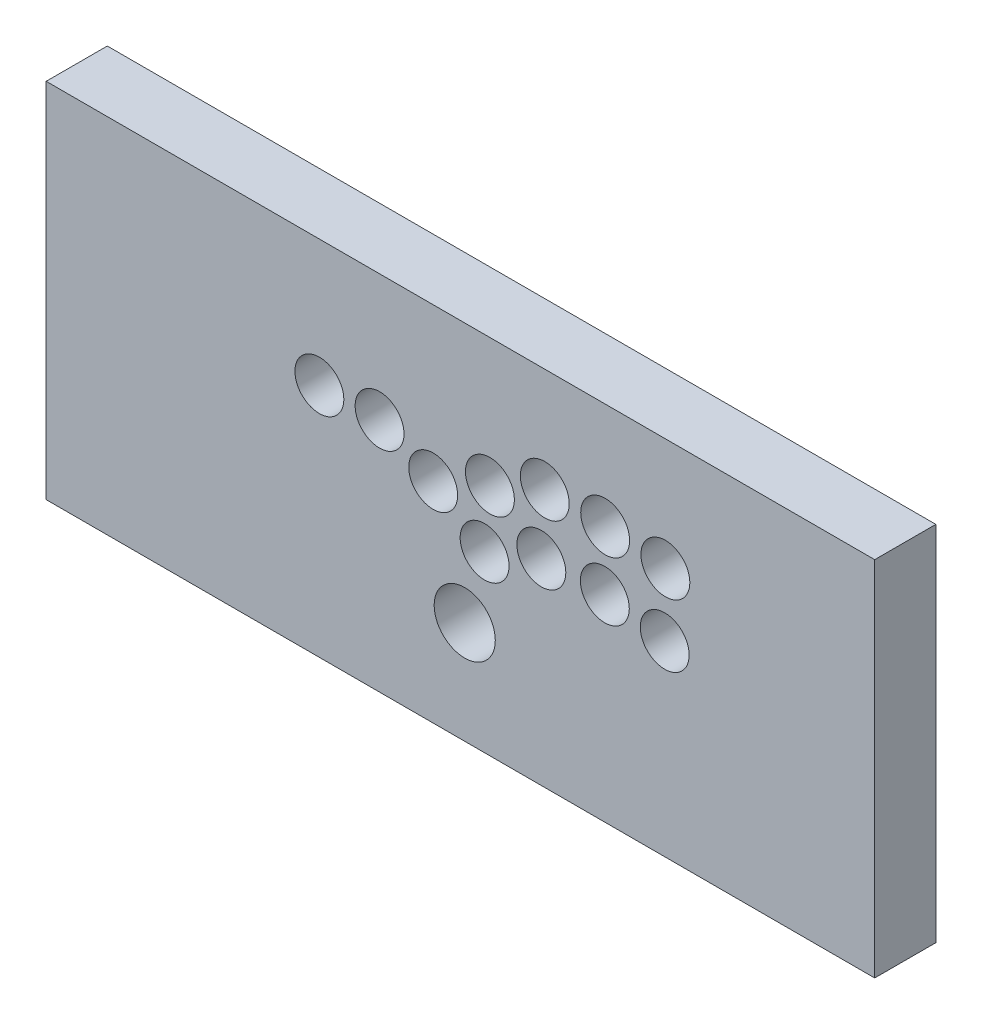
ISO-10303-21;
HEADER;
FILE_DESCRIPTION(('STEP AP214'),'2;1');
FILE_NAME('part.step','',(''),(''),'','','');
FILE_SCHEMA(('AUTOMOTIVE_DESIGN { 1 0 10303 214 1 1 1 1 }'));
ENDSEC;
DATA;
#1=APPLICATION_CONTEXT('core data for automotive mechanical design processes');
#2=APPLICATION_PROTOCOL_DEFINITION('international standard','automotive_design',2000,#1);
#3=PRODUCT_CONTEXT('',#1,'mechanical');
#4=PRODUCT('Part','Part','',(#3));
#5=PRODUCT_RELATED_PRODUCT_CATEGORY('part','',(#4));
#6=PRODUCT_DEFINITION_FORMATION('','',#4);
#7=PRODUCT_DEFINITION_CONTEXT('part definition',#1,'design');
#8=PRODUCT_DEFINITION('design','',#6,#7);
#9=PRODUCT_DEFINITION_SHAPE('','',#8);
#10=(LENGTH_UNIT() NAMED_UNIT(*) SI_UNIT(.MILLI.,.METRE.));
#11=(NAMED_UNIT(*) PLANE_ANGLE_UNIT() SI_UNIT($,.RADIAN.));
#12=(NAMED_UNIT(*) SI_UNIT($,.STERADIAN.) SOLID_ANGLE_UNIT());
#13=UNCERTAINTY_MEASURE_WITH_UNIT(LENGTH_MEASURE(1.E-05),#10,'distance_accuracy_value','');
#14=(GEOMETRIC_REPRESENTATION_CONTEXT(3) GLOBAL_UNCERTAINTY_ASSIGNED_CONTEXT((#13)) GLOBAL_UNIT_ASSIGNED_CONTEXT((#10,
#11,#12)) REPRESENTATION_CONTEXT('',''));
#15=CARTESIAN_POINT('',(0.,0.,0.));
#16=DIRECTION('',(0.,0.,1.));
#17=DIRECTION('',(1.,0.,0.));
#18=AXIS2_PLACEMENT_3D('',#15,#16,#17);
#19=CARTESIAN_POINT('',(134.079250809789,115.620543460692,30.));
#20=DIRECTION('',(0.,0.,-1.));
#21=DIRECTION('',(-1.,0.,0.));
#22=AXIS2_PLACEMENT_3D('',#19,#20,#21);
#23=CYLINDRICAL_SURFACE('',#22,12.);
#24=CARTESIAN_POINT('',(134.079250809789,115.620543460692,30.));
#25=DIRECTION('',(0.,0.,1.));
#26=DIRECTION('',(1.,0.,0.));
#27=AXIS2_PLACEMENT_3D('',#24,#25,#26);
#28=CIRCLE('',#27,12.);
#29=CARTESIAN_POINT('',(146.079250809789,115.620543460692,30.));
#30=VERTEX_POINT('',#29);
#31=EDGE_CURVE('E119',#30,#30,#28,.T.);
#32=ORIENTED_EDGE('',*,*,#31,.T.);
#33=EDGE_LOOP('',(#32));
#34=FACE_BOUND('',#33,.T.);
#35=CARTESIAN_POINT('',(134.079250809789,115.620543460692,4.));
#36=DIRECTION('',(0.,0.,-1.));
#37=DIRECTION('',(-1.,0.,0.));
#38=AXIS2_PLACEMENT_3D('',#35,#36,#37);
#39=CIRCLE('',#38,12.);
#40=CARTESIAN_POINT('',(122.079250809789,115.620543460692,4.));
#41=VERTEX_POINT('',#40);
#42=EDGE_CURVE('E182',#41,#41,#39,.T.);
#43=ORIENTED_EDGE('',*,*,#42,.T.);
#44=EDGE_LOOP('',(#43));
#45=FACE_BOUND('',#44,.T.);
#46=ADVANCED_FACE('F45',(#34,#45),#23,.F.);
#47=CARTESIAN_POINT('',(163.619308257506,115.709309954712,30.));
#48=DIRECTION('',(0.,0.,-1.));
#49=DIRECTION('',(-1.,0.,0.));
#50=AXIS2_PLACEMENT_3D('',#47,#48,#49);
#51=CYLINDRICAL_SURFACE('',#50,12.);
#52=CARTESIAN_POINT('',(163.619308257506,115.709309954712,30.));
#53=DIRECTION('',(0.,0.,1.));
#54=DIRECTION('',(1.,0.,0.));
#55=AXIS2_PLACEMENT_3D('',#52,#53,#54);
#56=CIRCLE('',#55,12.);
#57=CARTESIAN_POINT('',(175.619308257506,115.709309954712,30.));
#58=VERTEX_POINT('',#57);
#59=EDGE_CURVE('E138',#58,#58,#56,.T.);
#60=ORIENTED_EDGE('',*,*,#59,.T.);
#61=EDGE_LOOP('',(#60));
#62=FACE_BOUND('',#61,.T.);
#63=CARTESIAN_POINT('',(163.619308257506,115.709309954712,4.));
#64=DIRECTION('',(0.,0.,-1.));
#65=DIRECTION('',(-1.,0.,0.));
#66=AXIS2_PLACEMENT_3D('',#63,#64,#65);
#67=CIRCLE('',#66,12.);
#68=CARTESIAN_POINT('',(151.619308257506,115.709309954712,4.));
#69=VERTEX_POINT('',#68);
#70=EDGE_CURVE('E186',#69,#69,#67,.T.);
#71=ORIENTED_EDGE('',*,*,#70,.T.);
#72=EDGE_LOOP('',(#71));
#73=FACE_BOUND('',#72,.T.);
#74=ADVANCED_FACE('F251',(#62,#73),#51,.F.);
#75=CARTESIAN_POINT('',(189.931391461446,102.812951429492,30.));
#76=DIRECTION('',(0.,0.,-1.));
#77=DIRECTION('',(-1.,0.,0.));
#78=AXIS2_PLACEMENT_3D('',#75,#76,#77);
#79=CYLINDRICAL_SURFACE('',#78,12.);
#80=CARTESIAN_POINT('',(189.931391461446,102.812951429492,30.));
#81=DIRECTION('',(0.,0.,1.));
#82=DIRECTION('',(1.,0.,0.));
#83=AXIS2_PLACEMENT_3D('',#80,#81,#82);
#84=CIRCLE('',#83,12.);
#85=CARTESIAN_POINT('',(201.931391461446,102.812951429492,30.));
#86=VERTEX_POINT('',#85);
#87=EDGE_CURVE('E142',#86,#86,#84,.T.);
#88=ORIENTED_EDGE('',*,*,#87,.T.);
#89=EDGE_LOOP('',(#88));
#90=FACE_BOUND('',#89,.T.);
#91=CARTESIAN_POINT('',(189.931391461446,102.812951429492,4.));
#92=DIRECTION('',(0.,0.,-1.));
#93=DIRECTION('',(-1.,0.,0.));
#94=AXIS2_PLACEMENT_3D('',#91,#92,#93);
#95=CIRCLE('',#94,12.);
#96=CARTESIAN_POINT('',(177.931391461446,102.812951429492,4.));
#97=VERTEX_POINT('',#96);
#98=EDGE_CURVE('E190',#97,#97,#95,.T.);
#99=ORIENTED_EDGE('',*,*,#98,.T.);
#100=EDGE_LOOP('',(#99));
#101=FACE_BOUND('',#100,.T.);
#102=ADVANCED_FACE('F258',(#90,#101),#79,.F.);
#103=CARTESIAN_POINT('',(215.148770887191,85.4310451612831,30.));
#104=DIRECTION('',(0.,0.,-1.));
#105=DIRECTION('',(-1.,0.,0.));
#106=AXIS2_PLACEMENT_3D('',#103,#104,#105);
#107=CYLINDRICAL_SURFACE('',#106,12.);
#108=CARTESIAN_POINT('',(215.148770887191,85.4310451612831,30.));
#109=DIRECTION('',(0.,0.,1.));
#110=DIRECTION('',(1.,0.,0.));
#111=AXIS2_PLACEMENT_3D('',#108,#109,#110);
#112=CIRCLE('',#111,12.);
#113=CARTESIAN_POINT('',(227.148770887191,85.4310451612831,30.));
#114=VERTEX_POINT('',#113);
#115=EDGE_CURVE('E146',#114,#114,#112,.T.);
#116=ORIENTED_EDGE('',*,*,#115,.T.);
#117=EDGE_LOOP('',(#116));
#118=FACE_BOUND('',#117,.T.);
#119=CARTESIAN_POINT('',(215.148770887191,85.4310451612831,4.));
#120=DIRECTION('',(0.,0.,-1.));
#121=DIRECTION('',(-1.,0.,0.));
#122=AXIS2_PLACEMENT_3D('',#119,#120,#121);
#123=CIRCLE('',#122,12.);
#124=CARTESIAN_POINT('',(203.148770887191,85.4310451612831,4.));
#125=VERTEX_POINT('',#124);
#126=EDGE_CURVE('E194',#125,#125,#123,.T.);
#127=ORIENTED_EDGE('',*,*,#126,.T.);
#128=EDGE_LOOP('',(#127));
#129=FACE_BOUND('',#128,.T.);
#130=ADVANCED_FACE('F346',(#118,#129),#107,.F.);
#131=CARTESIAN_POINT('',(205.406615554664,50.3603644328971,30.));
#132=DIRECTION('',(0.,0.,-1.));
#133=DIRECTION('',(-1.,0.,0.));
#134=AXIS2_PLACEMENT_3D('',#131,#132,#133);
#135=CYLINDRICAL_SURFACE('',#134,15.);
#136=CARTESIAN_POINT('',(205.406615554664,50.3603644328971,30.));
#137=DIRECTION('',(0.,0.,1.));
#138=DIRECTION('',(1.,0.,0.));
#139=AXIS2_PLACEMENT_3D('',#136,#137,#138);
#140=CIRCLE('',#139,15.);
#141=CARTESIAN_POINT('',(220.406615554664,50.3603644328971,30.));
#142=VERTEX_POINT('',#141);
#143=EDGE_CURVE('E150',#142,#142,#140,.T.);
#144=ORIENTED_EDGE('',*,*,#143,.T.);
#145=EDGE_LOOP('',(#144));
#146=FACE_BOUND('',#145,.T.);
#147=CARTESIAN_POINT('',(205.406615554664,50.3603644328971,4.));
#148=DIRECTION('',(0.,0.,-1.));
#149=DIRECTION('',(-1.,0.,0.));
#150=AXIS2_PLACEMENT_3D('',#147,#148,#149);
#151=CIRCLE('',#150,15.);
#152=CARTESIAN_POINT('',(190.406615554664,50.3603644328971,4.));
#153=VERTEX_POINT('',#152);
#154=EDGE_CURVE('E198',#153,#153,#151,.T.);
#155=ORIENTED_EDGE('',*,*,#154,.T.);
#156=EDGE_LOOP('',(#155));
#157=FACE_BOUND('',#156,.T.);
#158=ADVANCED_FACE('F338',(#146,#157),#135,.F.);
#159=CARTESIAN_POINT('',(217.770290506371,114.829364890886,30.));
#160=DIRECTION('',(0.,0.,-1.));
#161=DIRECTION('',(-1.,0.,0.));
#162=AXIS2_PLACEMENT_3D('',#159,#160,#161);
#163=CYLINDRICAL_SURFACE('',#162,12.);
#164=CARTESIAN_POINT('',(217.770290506371,114.829364890886,30.));
#165=DIRECTION('',(0.,0.,1.));
#166=DIRECTION('',(1.,0.,0.));
#167=AXIS2_PLACEMENT_3D('',#164,#165,#166);
#168=CIRCLE('',#167,12.);
#169=CARTESIAN_POINT('',(229.770290506371,114.829364890886,30.));
#170=VERTEX_POINT('',#169);
#171=EDGE_CURVE('E154',#170,#170,#168,.T.);
#172=ORIENTED_EDGE('',*,*,#171,.T.);
#173=EDGE_LOOP('',(#172));
#174=FACE_BOUND('',#173,.T.);
#175=CARTESIAN_POINT('',(217.770290506371,114.829364890886,4.));
#176=DIRECTION('',(0.,0.,-1.));
#177=DIRECTION('',(-1.,0.,0.));
#178=AXIS2_PLACEMENT_3D('',#175,#176,#177);
#179=CIRCLE('',#178,12.);
#180=CARTESIAN_POINT('',(205.770290506371,114.829364890886,4.));
#181=VERTEX_POINT('',#180);
#182=EDGE_CURVE('E202',#181,#181,#179,.T.);
#183=ORIENTED_EDGE('',*,*,#182,.T.);
#184=EDGE_LOOP('',(#183));
#185=FACE_BOUND('',#184,.T.);
#186=ADVANCED_FACE('F330',(#174,#185),#163,.F.);
#187=CARTESIAN_POINT('',(244.688210228627,126.55124727172,30.));
#188=DIRECTION('',(0.,0.,-1.));
#189=DIRECTION('',(-1.,0.,0.));
#190=AXIS2_PLACEMENT_3D('',#187,#188,#189);
#191=CYLINDRICAL_SURFACE('',#190,12.);
#192=CARTESIAN_POINT('',(244.688210228627,126.55124727172,30.));
#193=DIRECTION('',(0.,0.,1.));
#194=DIRECTION('',(1.,0.,0.));
#195=AXIS2_PLACEMENT_3D('',#192,#193,#194);
#196=CIRCLE('',#195,12.);
#197=CARTESIAN_POINT('',(256.688210228627,126.55124727172,30.));
#198=VERTEX_POINT('',#197);
#199=EDGE_CURVE('E158',#198,#198,#196,.T.);
#200=ORIENTED_EDGE('',*,*,#199,.T.);
#201=EDGE_LOOP('',(#200));
#202=FACE_BOUND('',#201,.T.);
#203=CARTESIAN_POINT('',(244.688210228627,126.55124727172,4.));
#204=DIRECTION('',(0.,0.,-1.));
#205=DIRECTION('',(-1.,0.,0.));
#206=AXIS2_PLACEMENT_3D('',#203,#204,#205);
#207=CIRCLE('',#206,12.);
#208=CARTESIAN_POINT('',(232.688210228627,126.55124727172,4.));
#209=VERTEX_POINT('',#208);
#210=EDGE_CURVE('E206',#209,#209,#207,.T.);
#211=ORIENTED_EDGE('',*,*,#210,.T.);
#212=EDGE_LOOP('',(#211));
#213=FACE_BOUND('',#212,.T.);
#214=ADVANCED_FACE('F322',(#202,#213),#191,.F.);
#215=CARTESIAN_POINT('',(274.330365620166,125.743518947919,30.));
#216=DIRECTION('',(0.,0.,-1.));
#217=DIRECTION('',(-1.,0.,0.));
#218=AXIS2_PLACEMENT_3D('',#215,#216,#217);
#219=CYLINDRICAL_SURFACE('',#218,12.);
#220=CARTESIAN_POINT('',(274.330365620166,125.743518947919,30.));
#221=DIRECTION('',(0.,0.,1.));
#222=DIRECTION('',(1.,0.,0.));
#223=AXIS2_PLACEMENT_3D('',#220,#221,#222);
#224=CIRCLE('',#223,12.);
#225=CARTESIAN_POINT('',(286.330365620166,125.743518947919,30.));
#226=VERTEX_POINT('',#225);
#227=EDGE_CURVE('E162',#226,#226,#224,.T.);
#228=ORIENTED_EDGE('',*,*,#227,.T.);
#229=EDGE_LOOP('',(#228));
#230=FACE_BOUND('',#229,.T.);
#231=CARTESIAN_POINT('',(274.330365620166,125.743518947919,4.));
#232=DIRECTION('',(0.,0.,-1.));
#233=DIRECTION('',(-1.,0.,0.));
#234=AXIS2_PLACEMENT_3D('',#231,#232,#233);
#235=CIRCLE('',#234,12.);
#236=CARTESIAN_POINT('',(262.330365620166,125.743518947919,4.));
#237=VERTEX_POINT('',#236);
#238=EDGE_CURVE('E210',#237,#237,#235,.T.);
#239=ORIENTED_EDGE('',*,*,#238,.T.);
#240=EDGE_LOOP('',(#239));
#241=FACE_BOUND('',#240,.T.);
#242=ADVANCED_FACE('F314',(#230,#241),#219,.F.);
#243=CARTESIAN_POINT('',(303.876863168261,122.656060434376,30.));
#244=DIRECTION('',(0.,0.,-1.));
#245=DIRECTION('',(-1.,0.,0.));
#246=AXIS2_PLACEMENT_3D('',#243,#244,#245);
#247=CYLINDRICAL_SURFACE('',#246,12.);
#248=CARTESIAN_POINT('',(303.876863168261,122.656060434376,30.));
#249=DIRECTION('',(0.,0.,1.));
#250=DIRECTION('',(1.,0.,0.));
#251=AXIS2_PLACEMENT_3D('',#248,#249,#250);
#252=CIRCLE('',#251,12.);
#253=CARTESIAN_POINT('',(315.876863168261,122.656060434376,30.));
#254=VERTEX_POINT('',#253);
#255=EDGE_CURVE('E166',#254,#254,#252,.T.);
#256=ORIENTED_EDGE('',*,*,#255,.T.);
#257=EDGE_LOOP('',(#256));
#258=FACE_BOUND('',#257,.T.);
#259=CARTESIAN_POINT('',(303.876863168261,122.656060434376,4.));
#260=DIRECTION('',(0.,0.,-1.));
#261=DIRECTION('',(-1.,0.,0.));
#262=AXIS2_PLACEMENT_3D('',#259,#260,#261);
#263=CIRCLE('',#262,12.);
#264=CARTESIAN_POINT('',(291.876863168261,122.656060434376,4.));
#265=VERTEX_POINT('',#264);
#266=EDGE_CURVE('E214',#265,#265,#263,.T.);
#267=ORIENTED_EDGE('',*,*,#266,.T.);
#268=EDGE_LOOP('',(#267));
#269=FACE_BOUND('',#268,.T.);
#270=ADVANCED_FACE('F306',(#258,#269),#247,.F.);
#271=CARTESIAN_POINT('',(303.547623980309,91.7016931934191,30.));
#272=DIRECTION('',(0.,0.,-1.));
#273=DIRECTION('',(-1.,0.,0.));
#274=AXIS2_PLACEMENT_3D('',#271,#272,#273);
#275=CYLINDRICAL_SURFACE('',#274,12.);
#276=CARTESIAN_POINT('',(303.547623980309,91.7016931934191,30.));
#277=DIRECTION('',(0.,0.,1.));
#278=DIRECTION('',(1.,0.,0.));
#279=AXIS2_PLACEMENT_3D('',#276,#277,#278);
#280=CIRCLE('',#279,12.);
#281=CARTESIAN_POINT('',(315.547623980309,91.7016931934191,30.));
#282=VERTEX_POINT('',#281);
#283=EDGE_CURVE('E170',#282,#282,#280,.T.);
#284=ORIENTED_EDGE('',*,*,#283,.T.);
#285=EDGE_LOOP('',(#284));
#286=FACE_BOUND('',#285,.T.);
#287=CARTESIAN_POINT('',(303.547623980309,91.7016931934191,4.));
#288=DIRECTION('',(0.,0.,-1.));
#289=DIRECTION('',(-1.,0.,0.));
#290=AXIS2_PLACEMENT_3D('',#287,#288,#289);
#291=CIRCLE('',#290,12.);
#292=CARTESIAN_POINT('',(291.54762398031,91.7016931934191,4.));
#293=VERTEX_POINT('',#292);
#294=EDGE_CURVE('E218',#293,#293,#291,.T.);
#295=ORIENTED_EDGE('',*,*,#294,.T.);
#296=EDGE_LOOP('',(#295));
#297=FACE_BOUND('',#296,.T.);
#298=ADVANCED_FACE('F298',(#286,#297),#275,.F.);
#299=CARTESIAN_POINT('',(274.160623302342,96.7225198912755,30.));
#300=DIRECTION('',(0.,0.,-1.));
#301=DIRECTION('',(-1.,0.,0.));
#302=AXIS2_PLACEMENT_3D('',#299,#300,#301);
#303=CYLINDRICAL_SURFACE('',#302,12.);
#304=CARTESIAN_POINT('',(274.160623302342,96.7225198912755,30.));
#305=DIRECTION('',(0.,0.,1.));
#306=DIRECTION('',(1.,0.,0.));
#307=AXIS2_PLACEMENT_3D('',#304,#305,#306);
#308=CIRCLE('',#307,12.);
#309=CARTESIAN_POINT('',(286.160623302342,96.7225198912755,30.));
#310=VERTEX_POINT('',#309);
#311=EDGE_CURVE('E174',#310,#310,#308,.T.);
#312=ORIENTED_EDGE('',*,*,#311,.T.);
#313=EDGE_LOOP('',(#312));
#314=FACE_BOUND('',#313,.T.);
#315=CARTESIAN_POINT('',(274.160623302342,96.7225198912755,4.));
#316=DIRECTION('',(0.,0.,-1.));
#317=DIRECTION('',(-1.,0.,0.));
#318=AXIS2_PLACEMENT_3D('',#315,#316,#317);
#319=CIRCLE('',#318,12.);
#320=CARTESIAN_POINT('',(262.160623302342,96.7225198912755,4.));
#321=VERTEX_POINT('',#320);
#322=EDGE_CURVE('E222',#321,#321,#319,.T.);
#323=ORIENTED_EDGE('',*,*,#322,.T.);
#324=EDGE_LOOP('',(#323));
#325=FACE_BOUND('',#324,.T.);
#326=ADVANCED_FACE('F290',(#314,#325),#303,.F.);
#327=CARTESIAN_POINT('',(243.010025323637,96.4473438033064,30.));
#328=DIRECTION('',(0.,0.,-1.));
#329=DIRECTION('',(-1.,0.,0.));
#330=AXIS2_PLACEMENT_3D('',#327,#328,#329);
#331=CYLINDRICAL_SURFACE('',#330,12.);
#332=CARTESIAN_POINT('',(243.010025323637,96.4473438033064,30.));
#333=DIRECTION('',(0.,0.,1.));
#334=DIRECTION('',(1.,0.,0.));
#335=AXIS2_PLACEMENT_3D('',#332,#333,#334);
#336=CIRCLE('',#335,12.);
#337=CARTESIAN_POINT('',(255.010025323637,96.4473438033064,30.));
#338=VERTEX_POINT('',#337);
#339=EDGE_CURVE('E178',#338,#338,#336,.T.);
#340=ORIENTED_EDGE('',*,*,#339,.T.);
#341=EDGE_LOOP('',(#340));
#342=FACE_BOUND('',#341,.T.);
#343=CARTESIAN_POINT('',(243.010025323637,96.4473438033064,4.));
#344=DIRECTION('',(0.,0.,-1.));
#345=DIRECTION('',(-1.,0.,0.));
#346=AXIS2_PLACEMENT_3D('',#343,#344,#345);
#347=CIRCLE('',#346,12.);
#348=CARTESIAN_POINT('',(231.010025323637,96.4473438033064,4.));
#349=VERTEX_POINT('',#348);
#350=EDGE_CURVE('E49',#349,#349,#347,.T.);
#351=ORIENTED_EDGE('',*,*,#350,.T.);
#352=EDGE_LOOP('',(#351));
#353=FACE_BOUND('',#352,.T.);
#354=ADVANCED_FACE('F231',(#342,#353),#331,.F.);
#355=CARTESIAN_POINT('',(0.,0.,30.));
#356=DIRECTION('',(0.,0.,1.));
#357=DIRECTION('',(1.,0.,0.));
#358=AXIS2_PLACEMENT_3D('',#355,#356,#357);
#359=PLANE('',#358);
#360=ORIENTED_EDGE('',*,*,#311,.F.);
#361=EDGE_LOOP('',(#360));
#362=FACE_BOUND('',#361,.T.);
#363=ORIENTED_EDGE('',*,*,#255,.F.);
#364=EDGE_LOOP('',(#363));
#365=FACE_BOUND('',#364,.T.);
#366=ORIENTED_EDGE('',*,*,#199,.F.);
#367=EDGE_LOOP('',(#366));
#368=FACE_BOUND('',#367,.T.);
#369=ORIENTED_EDGE('',*,*,#143,.F.);
#370=EDGE_LOOP('',(#369));
#371=FACE_BOUND('',#370,.T.);
#372=ORIENTED_EDGE('',*,*,#87,.F.);
#373=EDGE_LOOP('',(#372));
#374=FACE_BOUND('',#373,.T.);
#375=ORIENTED_EDGE('',*,*,#31,.F.);
#376=EDGE_LOOP('',(#375));
#377=FACE_BOUND('',#376,.T.);
#378=DIRECTION('',(0.,-1.,0.));
#379=VECTOR('',#378,1.);
#380=CARTESIAN_POINT('',(0.,177.8,30.));
#381=LINE('',#380,#379);
#382=CARTESIAN_POINT('',(0.,177.8,30.));
#383=VERTEX_POINT('',#382);
#384=CARTESIAN_POINT('',(0.,0.,30.));
#385=VERTEX_POINT('',#384);
#386=EDGE_CURVE('E97',#383,#385,#381,.T.);
#387=ORIENTED_EDGE('',*,*,#386,.T.);
#388=DIRECTION('',(1.,0.,0.));
#389=VECTOR('',#388,1.);
#390=CARTESIAN_POINT('',(0.,0.,30.));
#391=LINE('',#390,#389);
#392=CARTESIAN_POINT('',(406.6,0.,30.));
#393=VERTEX_POINT('',#392);
#394=EDGE_CURVE('E92',#385,#393,#391,.T.);
#395=ORIENTED_EDGE('',*,*,#394,.T.);
#396=DIRECTION('',(0.,1.,0.));
#397=VECTOR('',#396,1.);
#398=CARTESIAN_POINT('',(406.6,177.8,30.));
#399=LINE('',#398,#397);
#400=CARTESIAN_POINT('',(406.6,177.8,30.));
#401=VERTEX_POINT('',#400);
#402=EDGE_CURVE('E96',#393,#401,#399,.T.);
#403=ORIENTED_EDGE('',*,*,#402,.T.);
#404=DIRECTION('',(-1.,0.,0.));
#405=VECTOR('',#404,1.);
#406=CARTESIAN_POINT('',(0.,177.8,30.));
#407=LINE('',#406,#405);
#408=EDGE_CURVE('E64',#401,#383,#407,.T.);
#409=ORIENTED_EDGE('',*,*,#408,.T.);
#410=EDGE_LOOP('',(#387,#395,#403,#409));
#411=FACE_BOUND('',#410,.T.);
#412=ORIENTED_EDGE('',*,*,#59,.F.);
#413=EDGE_LOOP('',(#412));
#414=FACE_BOUND('',#413,.T.);
#415=ORIENTED_EDGE('',*,*,#115,.F.);
#416=EDGE_LOOP('',(#415));
#417=FACE_BOUND('',#416,.T.);
#418=ORIENTED_EDGE('',*,*,#171,.F.);
#419=EDGE_LOOP('',(#418));
#420=FACE_BOUND('',#419,.T.);
#421=ORIENTED_EDGE('',*,*,#227,.F.);
#422=EDGE_LOOP('',(#421));
#423=FACE_BOUND('',#422,.T.);
#424=ORIENTED_EDGE('',*,*,#283,.F.);
#425=EDGE_LOOP('',(#424));
#426=FACE_BOUND('',#425,.T.);
#427=ORIENTED_EDGE('',*,*,#339,.F.);
#428=EDGE_LOOP('',(#427));
#429=FACE_BOUND('',#428,.T.);
#430=ADVANCED_FACE('F93',(#362,#365,#368,#371,#374,#377,#411,#414,#417,#420,#423,#426,#429),
#359,.T.);
#431=CARTESIAN_POINT('',(0.,0.,0.));
#432=DIRECTION('',(0.,0.,1.));
#433=DIRECTION('',(1.,0.,0.));
#434=AXIS2_PLACEMENT_3D('',#431,#432,#433);
#435=PLANE('',#434);
#436=DIRECTION('',(0.,-1.,0.));
#437=VECTOR('',#436,1.);
#438=CARTESIAN_POINT('',(0.,177.8,0.));
#439=LINE('',#438,#437);
#440=CARTESIAN_POINT('',(0.,177.8,0.));
#441=VERTEX_POINT('',#440);
#442=CARTESIAN_POINT('',(0.,0.,0.));
#443=VERTEX_POINT('',#442);
#444=EDGE_CURVE('E116',#441,#443,#439,.T.);
#445=ORIENTED_EDGE('',*,*,#444,.F.);
#446=DIRECTION('',(-1.,0.,0.));
#447=VECTOR('',#446,1.);
#448=CARTESIAN_POINT('',(0.,177.8,0.));
#449=LINE('',#448,#447);
#450=CARTESIAN_POINT('',(406.6,177.8,0.));
#451=VERTEX_POINT('',#450);
#452=EDGE_CURVE('E125',#451,#441,#449,.T.);
#453=ORIENTED_EDGE('',*,*,#452,.F.);
#454=DIRECTION('',(0.,1.,0.));
#455=VECTOR('',#454,1.);
#456=CARTESIAN_POINT('',(406.6,177.8,0.));
#457=LINE('',#456,#455);
#458=CARTESIAN_POINT('',(406.6,0.,0.));
#459=VERTEX_POINT('',#458);
#460=EDGE_CURVE('E122',#459,#451,#457,.T.);
#461=ORIENTED_EDGE('',*,*,#460,.F.);
#462=DIRECTION('',(1.,0.,0.));
#463=VECTOR('',#462,1.);
#464=CARTESIAN_POINT('',(0.,0.,0.));
#465=LINE('',#464,#463);
#466=EDGE_CURVE('E104',#443,#459,#465,.T.);
#467=ORIENTED_EDGE('',*,*,#466,.F.);
#468=EDGE_LOOP('',(#445,#453,#461,#467));
#469=FACE_BOUND('',#468,.T.);
#470=ADVANCED_FACE('F265',(#469),#435,.F.);
#471=CARTESIAN_POINT('',(0.,177.8,30.));
#472=DIRECTION('',(1.,0.,0.));
#473=DIRECTION('',(0.,0.,-1.));
#474=AXIS2_PLACEMENT_3D('',#471,#472,#473);
#475=PLANE('',#474);
#476=ORIENTED_EDGE('',*,*,#444,.T.);
#477=DIRECTION('',(0.,0.,-1.));
#478=VECTOR('',#477,1.);
#479=CARTESIAN_POINT('',(0.,0.,30.));
#480=LINE('',#479,#478);
#481=EDGE_CURVE('E11',#385,#443,#480,.T.);
#482=ORIENTED_EDGE('',*,*,#481,.F.);
#483=ORIENTED_EDGE('',*,*,#386,.F.);
#484=DIRECTION('',(0.,0.,-1.));
#485=VECTOR('',#484,1.);
#486=CARTESIAN_POINT('',(0.,177.8,30.));
#487=LINE('',#486,#485);
#488=EDGE_CURVE('E86',#383,#441,#487,.T.);
#489=ORIENTED_EDGE('',*,*,#488,.T.);
#490=EDGE_LOOP('',(#476,#482,#483,#489));
#491=FACE_BOUND('',#490,.T.);
#492=ADVANCED_FACE('F47',(#491),#475,.F.);
#493=CARTESIAN_POINT('',(0.,0.,30.));
#494=DIRECTION('',(0.,1.,0.));
#495=DIRECTION('',(0.,0.,1.));
#496=AXIS2_PLACEMENT_3D('',#493,#494,#495);
#497=PLANE('',#496);
#498=ORIENTED_EDGE('',*,*,#466,.T.);
#499=DIRECTION('',(0.,0.,-1.));
#500=VECTOR('',#499,1.);
#501=CARTESIAN_POINT('',(406.6,0.,30.));
#502=LINE('',#501,#500);
#503=EDGE_CURVE('E56',#393,#459,#502,.T.);
#504=ORIENTED_EDGE('',*,*,#503,.F.);
#505=ORIENTED_EDGE('',*,*,#394,.F.);
#506=ORIENTED_EDGE('',*,*,#481,.T.);
#507=EDGE_LOOP('',(#498,#504,#505,#506));
#508=FACE_BOUND('',#507,.T.);
#509=ADVANCED_FACE('F102',(#508),#497,.F.);
#510=CARTESIAN_POINT('',(406.6,177.8,30.));
#511=DIRECTION('',(-1.,0.,0.));
#512=DIRECTION('',(0.,0.,1.));
#513=AXIS2_PLACEMENT_3D('',#510,#511,#512);
#514=PLANE('',#513);
#515=ORIENTED_EDGE('',*,*,#460,.T.);
#516=DIRECTION('',(0.,0.,-1.));
#517=VECTOR('',#516,1.);
#518=CARTESIAN_POINT('',(406.6,177.8,30.));
#519=LINE('',#518,#517);
#520=EDGE_CURVE('E79',#401,#451,#519,.T.);
#521=ORIENTED_EDGE('',*,*,#520,.F.);
#522=ORIENTED_EDGE('',*,*,#402,.F.);
#523=ORIENTED_EDGE('',*,*,#503,.T.);
#524=EDGE_LOOP('',(#515,#521,#522,#523));
#525=FACE_BOUND('',#524,.T.);
#526=ADVANCED_FACE('F109',(#525),#514,.F.);
#527=CARTESIAN_POINT('',(0.,177.8,30.));
#528=DIRECTION('',(0.,-1.,0.));
#529=DIRECTION('',(0.,0.,-1.));
#530=AXIS2_PLACEMENT_3D('',#527,#528,#529);
#531=PLANE('',#530);
#532=ORIENTED_EDGE('',*,*,#452,.T.);
#533=ORIENTED_EDGE('',*,*,#488,.F.);
#534=ORIENTED_EDGE('',*,*,#408,.F.);
#535=ORIENTED_EDGE('',*,*,#520,.T.);
#536=EDGE_LOOP('',(#532,#533,#534,#535));
#537=FACE_BOUND('',#536,.T.);
#538=ADVANCED_FACE('F236',(#537),#531,.F.);
#539=CARTESIAN_POINT('',(0.,0.,4.));
#540=DIRECTION('',(0.,0.,-1.));
#541=DIRECTION('',(-1.,0.,0.));
#542=AXIS2_PLACEMENT_3D('',#539,#540,#541);
#543=PLANE('',#542);
#544=ORIENTED_EDGE('',*,*,#350,.F.);
#545=EDGE_LOOP('',(#544));
#546=FACE_BOUND('',#545,.T.);
#547=ADVANCED_FACE('F233',(#546),#543,.F.);
#548=ORIENTED_EDGE('',*,*,#322,.F.);
#549=EDGE_LOOP('',(#548));
#550=FACE_BOUND('',#549,.T.);
#551=ADVANCED_FACE('F235',(#550),#543,.F.);
#552=ORIENTED_EDGE('',*,*,#294,.F.);
#553=EDGE_LOOP('',(#552));
#554=FACE_BOUND('',#553,.T.);
#555=ADVANCED_FACE('F243',(#554),#543,.F.);
#556=ORIENTED_EDGE('',*,*,#266,.F.);
#557=EDGE_LOOP('',(#556));
#558=FACE_BOUND('',#557,.T.);
#559=ADVANCED_FACE('F386',(#558),#543,.F.);
#560=ORIENTED_EDGE('',*,*,#238,.F.);
#561=EDGE_LOOP('',(#560));
#562=FACE_BOUND('',#561,.T.);
#563=ADVANCED_FACE('F394',(#562),#543,.F.);
#564=ORIENTED_EDGE('',*,*,#210,.F.);
#565=EDGE_LOOP('',(#564));
#566=FACE_BOUND('',#565,.T.);
#567=ADVANCED_FACE('F402',(#566),#543,.F.);
#568=ORIENTED_EDGE('',*,*,#182,.F.);
#569=EDGE_LOOP('',(#568));
#570=FACE_BOUND('',#569,.T.);
#571=ADVANCED_FACE('F410',(#570),#543,.F.);
#572=ORIENTED_EDGE('',*,*,#154,.F.);
#573=EDGE_LOOP('',(#572));
#574=FACE_BOUND('',#573,.T.);
#575=ADVANCED_FACE('F418',(#574),#543,.F.);
#576=ORIENTED_EDGE('',*,*,#126,.F.);
#577=EDGE_LOOP('',(#576));
#578=FACE_BOUND('',#577,.T.);
#579=ADVANCED_FACE('F426',(#578),#543,.F.);
#580=ORIENTED_EDGE('',*,*,#98,.F.);
#581=EDGE_LOOP('',(#580));
#582=FACE_BOUND('',#581,.T.);
#583=ADVANCED_FACE('F434',(#582),#543,.F.);
#584=ORIENTED_EDGE('',*,*,#70,.F.);
#585=EDGE_LOOP('',(#584));
#586=FACE_BOUND('',#585,.T.);
#587=ADVANCED_FACE('F248',(#586),#543,.F.);
#588=ORIENTED_EDGE('',*,*,#42,.F.);
#589=EDGE_LOOP('',(#588));
#590=FACE_BOUND('',#589,.T.);
#591=ADVANCED_FACE('F238',(#590),#543,.F.);
#592=CLOSED_SHELL('',(#46,#74,#102,#130,#158,#186,#214,#242,#270,#298,#326,#354,#430,#470,#492,
#509,#526,#538,#547,#551,#555,#559,#563,#567,#571,#575,#579,#583,#587,#591));
#593=MANIFOLD_SOLID_BREP('B2',#592);
#594=ADVANCED_BREP_SHAPE_REPRESENTATION('',(#18,#593),#14);
#595=SHAPE_DEFINITION_REPRESENTATION(#9,#594);
ENDSEC;
END-ISO-10303-21;
